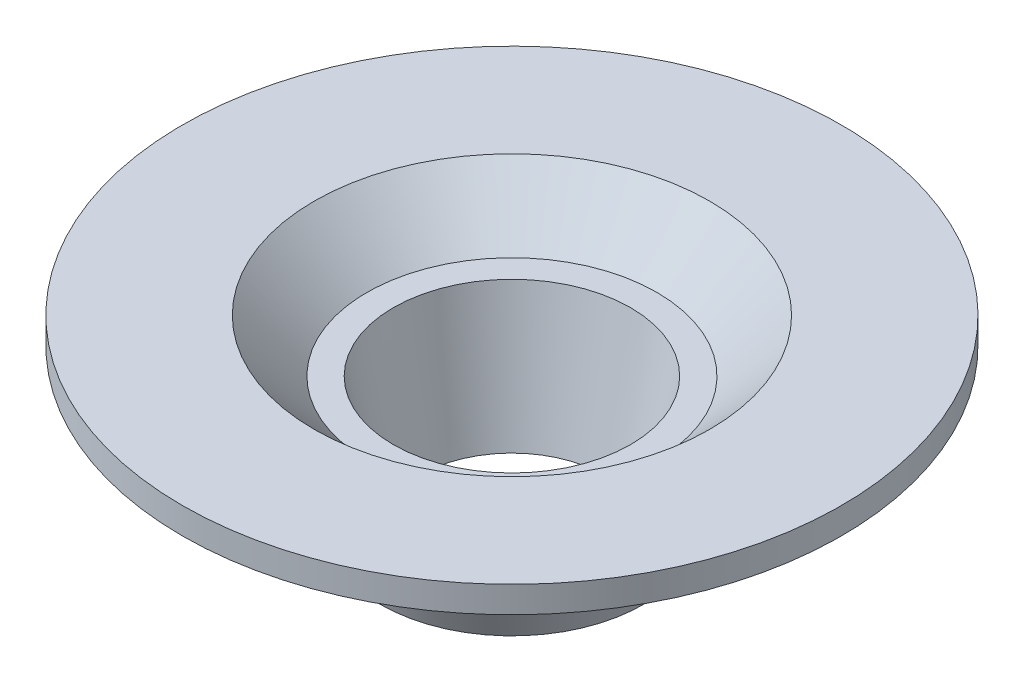
ISO-10303-21;
HEADER;
FILE_DESCRIPTION(('STEP AP214'),'2;1');
FILE_NAME('part.step','',(''),(''),'','','');
FILE_SCHEMA(('AUTOMOTIVE_DESIGN { 1 0 10303 214 1 1 1 1 }'));
ENDSEC;
DATA;
#1=APPLICATION_CONTEXT('core data for automotive mechanical design processes');
#2=APPLICATION_PROTOCOL_DEFINITION('international standard','automotive_design',2000,#1);
#3=PRODUCT_CONTEXT('',#1,'mechanical');
#4=PRODUCT('Part','Part','',(#3));
#5=PRODUCT_RELATED_PRODUCT_CATEGORY('part','',(#4));
#6=PRODUCT_DEFINITION_FORMATION('','',#4);
#7=PRODUCT_DEFINITION_CONTEXT('part definition',#1,'design');
#8=PRODUCT_DEFINITION('design','',#6,#7);
#9=PRODUCT_DEFINITION_SHAPE('','',#8);
#10=(LENGTH_UNIT() NAMED_UNIT(*) SI_UNIT(.MILLI.,.METRE.));
#11=(NAMED_UNIT(*) PLANE_ANGLE_UNIT() SI_UNIT($,.RADIAN.));
#12=(NAMED_UNIT(*) SI_UNIT($,.STERADIAN.) SOLID_ANGLE_UNIT());
#13=UNCERTAINTY_MEASURE_WITH_UNIT(LENGTH_MEASURE(1.E-05),#10,'distance_accuracy_value','');
#14=(GEOMETRIC_REPRESENTATION_CONTEXT(3) GLOBAL_UNCERTAINTY_ASSIGNED_CONTEXT((#13)) GLOBAL_UNIT_ASSIGNED_CONTEXT((#10,
#11,#12)) REPRESENTATION_CONTEXT('',''));
#15=CARTESIAN_POINT('',(0.,0.,0.));
#16=DIRECTION('',(0.,0.,1.));
#17=DIRECTION('',(1.,0.,0.));
#18=AXIS2_PLACEMENT_3D('',#15,#16,#17);
#19=CARTESIAN_POINT('',(0.,0.,-5.5));
#20=DIRECTION('',(0.,-1.,0.));
#21=DIRECTION('',(0.,0.,-1.));
#22=AXIS2_PLACEMENT_3D('',#19,#20,#21);
#23=PLANE('',#22);
#24=CARTESIAN_POINT('',(0.,0.,0.));
#25=DIRECTION('',(0.,1.,0.));
#26=DIRECTION('',(0.,0.,1.));
#27=AXIS2_PLACEMENT_3D('',#24,#25,#26);
#28=CIRCLE('',#27,4.5);
#29=CARTESIAN_POINT('',(0.,0.,4.5));
#30=VERTEX_POINT('',#29);
#31=EDGE_CURVE('E87',#30,#30,#28,.T.);
#32=ORIENTED_EDGE('',*,*,#31,.F.);
#33=EDGE_LOOP('',(#32));
#34=FACE_BOUND('',#33,.T.);
#35=CARTESIAN_POINT('',(0.,0.,0.));
#36=DIRECTION('',(0.,1.,0.));
#37=DIRECTION('',(0.,0.,1.));
#38=AXIS2_PLACEMENT_3D('',#35,#36,#37);
#39=CIRCLE('',#38,5.5);
#40=CARTESIAN_POINT('',(0.,0.,5.5));
#41=VERTEX_POINT('',#40);
#42=EDGE_CURVE('E10',#41,#41,#39,.T.);
#43=ORIENTED_EDGE('',*,*,#42,.T.);
#44=EDGE_LOOP('',(#43));
#45=FACE_BOUND('',#44,.T.);
#46=ADVANCED_FACE('F40',(#34,#45),#23,.F.);
#47=CARTESIAN_POINT('',(0.,2.,0.));
#48=DIRECTION('',(0.,1.,0.));
#49=DIRECTION('',(0.,0.,1.));
#50=AXIS2_PLACEMENT_3D('',#47,#48,#49);
#51=CONICAL_SURFACE('',#50,7.5,0.785398163397448);
#52=ORIENTED_EDGE('',*,*,#42,.F.);
#53=EDGE_LOOP('',(#52));
#54=FACE_BOUND('',#53,.T.);
#55=CARTESIAN_POINT('',(0.,2.,0.));
#56=DIRECTION('',(0.,1.,0.));
#57=DIRECTION('',(0.,0.,1.));
#58=AXIS2_PLACEMENT_3D('',#55,#56,#57);
#59=CIRCLE('',#58,7.5);
#60=CARTESIAN_POINT('',(0.,2.,7.5));
#61=VERTEX_POINT('',#60);
#62=EDGE_CURVE('E47',#61,#61,#59,.T.);
#63=ORIENTED_EDGE('',*,*,#62,.T.);
#64=EDGE_LOOP('',(#63));
#65=FACE_BOUND('',#64,.T.);
#66=ADVANCED_FACE('F97',(#54,#65),#51,.F.);
#67=CARTESIAN_POINT('',(0.,2.,-12.5));
#68=DIRECTION('',(0.,-1.,0.));
#69=DIRECTION('',(0.,0.,-1.));
#70=AXIS2_PLACEMENT_3D('',#67,#68,#69);
#71=PLANE('',#70);
#72=ORIENTED_EDGE('',*,*,#62,.F.);
#73=EDGE_LOOP('',(#72));
#74=FACE_BOUND('',#73,.T.);
#75=CARTESIAN_POINT('',(0.,2.,0.));
#76=DIRECTION('',(0.,1.,0.));
#77=DIRECTION('',(0.,0.,1.));
#78=AXIS2_PLACEMENT_3D('',#75,#76,#77);
#79=CIRCLE('',#78,12.5);
#80=CARTESIAN_POINT('',(0.,2.,12.5));
#81=VERTEX_POINT('',#80);
#82=EDGE_CURVE('E54',#81,#81,#79,.T.);
#83=ORIENTED_EDGE('',*,*,#82,.T.);
#84=EDGE_LOOP('',(#83));
#85=FACE_BOUND('',#84,.T.);
#86=ADVANCED_FACE('F101',(#74,#85),#71,.F.);
#87=CARTESIAN_POINT('',(0.,0.,0.));
#88=DIRECTION('',(0.,1.,0.));
#89=DIRECTION('',(0.,0.,1.));
#90=AXIS2_PLACEMENT_3D('',#87,#88,#89);
#91=CYLINDRICAL_SURFACE('',#90,12.5);
#92=ORIENTED_EDGE('',*,*,#82,.F.);
#93=EDGE_LOOP('',(#92));
#94=FACE_BOUND('',#93,.T.);
#95=CARTESIAN_POINT('',(0.,1.,0.));
#96=DIRECTION('',(0.,1.,0.));
#97=DIRECTION('',(0.,0.,1.));
#98=AXIS2_PLACEMENT_3D('',#95,#96,#97);
#99=CIRCLE('',#98,12.5);
#100=CARTESIAN_POINT('',(0.,0.999999999999998,12.5));
#101=VERTEX_POINT('',#100);
#102=EDGE_CURVE('E61',#101,#101,#99,.T.);
#103=ORIENTED_EDGE('',*,*,#102,.T.);
#104=EDGE_LOOP('',(#103));
#105=FACE_BOUND('',#104,.T.);
#106=ADVANCED_FACE('F106',(#94,#105),#91,.T.);
#107=CARTESIAN_POINT('',(0.,1.,-10.5));
#108=DIRECTION('',(0.,1.,0.));
#109=DIRECTION('',(0.,0.,1.));
#110=AXIS2_PLACEMENT_3D('',#107,#108,#109);
#111=PLANE('',#110);
#112=ORIENTED_EDGE('',*,*,#102,.F.);
#113=EDGE_LOOP('',(#112));
#114=FACE_BOUND('',#113,.T.);
#115=CARTESIAN_POINT('',(0.,1.,0.));
#116=DIRECTION('',(0.,1.,0.));
#117=DIRECTION('',(0.,0.,1.));
#118=AXIS2_PLACEMENT_3D('',#115,#116,#117);
#119=CIRCLE('',#118,10.5);
#120=CARTESIAN_POINT('',(0.,0.999999999999999,10.5));
#121=VERTEX_POINT('',#120);
#122=EDGE_CURVE('E67',#121,#121,#119,.T.);
#123=ORIENTED_EDGE('',*,*,#122,.T.);
#124=EDGE_LOOP('',(#123));
#125=FACE_BOUND('',#124,.T.);
#126=ADVANCED_FACE('F112',(#114,#125),#111,.F.);
#127=CARTESIAN_POINT('',(0.,-1.,0.));
#128=DIRECTION('',(0.,1.,0.));
#129=DIRECTION('',(0.,0.,1.));
#130=AXIS2_PLACEMENT_3D('',#127,#128,#129);
#131=CONICAL_SURFACE('',#130,8.5,0.785398163397449);
#132=ORIENTED_EDGE('',*,*,#122,.F.);
#133=EDGE_LOOP('',(#132));
#134=FACE_BOUND('',#133,.T.);
#135=CARTESIAN_POINT('',(0.,-1.,0.));
#136=DIRECTION('',(0.,1.,0.));
#137=DIRECTION('',(0.,0.,1.));
#138=AXIS2_PLACEMENT_3D('',#135,#136,#137);
#139=CIRCLE('',#138,8.5);
#140=CARTESIAN_POINT('',(0.,-1.,8.5));
#141=VERTEX_POINT('',#140);
#142=EDGE_CURVE('E71',#141,#141,#139,.T.);
#143=ORIENTED_EDGE('',*,*,#142,.T.);
#144=EDGE_LOOP('',(#143));
#145=FACE_BOUND('',#144,.T.);
#146=ADVANCED_FACE('F116',(#134,#145),#131,.T.);
#147=CARTESIAN_POINT('',(0.,-1.,-6.5));
#148=DIRECTION('',(0.,1.,0.));
#149=DIRECTION('',(0.,0.,1.));
#150=AXIS2_PLACEMENT_3D('',#147,#148,#149);
#151=PLANE('',#150);
#152=ORIENTED_EDGE('',*,*,#142,.F.);
#153=EDGE_LOOP('',(#152));
#154=FACE_BOUND('',#153,.T.);
#155=CARTESIAN_POINT('',(0.,-1.,0.));
#156=DIRECTION('',(0.,1.,0.));
#157=DIRECTION('',(0.,0.,1.));
#158=AXIS2_PLACEMENT_3D('',#155,#156,#157);
#159=CIRCLE('',#158,6.5);
#160=CARTESIAN_POINT('',(0.,-1.,6.5));
#161=VERTEX_POINT('',#160);
#162=EDGE_CURVE('E75',#161,#161,#159,.T.);
#163=ORIENTED_EDGE('',*,*,#162,.T.);
#164=EDGE_LOOP('',(#163));
#165=FACE_BOUND('',#164,.T.);
#166=ADVANCED_FACE('F120',(#154,#165),#151,.F.);
#167=CARTESIAN_POINT('',(0.,-5.,0.));
#168=DIRECTION('',(0.,1.,0.));
#169=DIRECTION('',(0.,0.,1.));
#170=AXIS2_PLACEMENT_3D('',#167,#168,#169);
#171=CONICAL_SURFACE('',#170,4.99694349375628,0.359440421092515);
#172=ORIENTED_EDGE('',*,*,#162,.F.);
#173=EDGE_LOOP('',(#172));
#174=FACE_BOUND('',#173,.T.);
#175=CARTESIAN_POINT('',(0.,-5.,0.));
#176=DIRECTION('',(0.,1.,0.));
#177=DIRECTION('',(0.,0.,1.));
#178=AXIS2_PLACEMENT_3D('',#175,#176,#177);
#179=CIRCLE('',#178,4.99694349375628);
#180=CARTESIAN_POINT('',(0.,-5.,4.99694349375628));
#181=VERTEX_POINT('',#180);
#182=EDGE_CURVE('E79',#181,#181,#179,.T.);
#183=ORIENTED_EDGE('',*,*,#182,.T.);
#184=EDGE_LOOP('',(#183));
#185=FACE_BOUND('',#184,.T.);
#186=ADVANCED_FACE('F124',(#174,#185),#171,.T.);
#187=CARTESIAN_POINT('',(0.,-5.,-3.49694349375628));
#188=DIRECTION('',(0.,1.,0.));
#189=DIRECTION('',(0.,0.,1.));
#190=AXIS2_PLACEMENT_3D('',#187,#188,#189);
#191=PLANE('',#190);
#192=ORIENTED_EDGE('',*,*,#182,.F.);
#193=EDGE_LOOP('',(#192));
#194=FACE_BOUND('',#193,.T.);
#195=CARTESIAN_POINT('',(0.,-5.,0.));
#196=DIRECTION('',(0.,1.,0.));
#197=DIRECTION('',(0.,0.,1.));
#198=AXIS2_PLACEMENT_3D('',#195,#196,#197);
#199=CIRCLE('',#198,3.49694349375628);
#200=CARTESIAN_POINT('',(0.,-5.,3.49694349375628));
#201=VERTEX_POINT('',#200);
#202=EDGE_CURVE('E83',#201,#201,#199,.T.);
#203=ORIENTED_EDGE('',*,*,#202,.T.);
#204=EDGE_LOOP('',(#203));
#205=FACE_BOUND('',#204,.T.);
#206=ADVANCED_FACE('F128',(#194,#205),#191,.F.);
#207=CARTESIAN_POINT('',(0.,0.,0.));
#208=DIRECTION('',(0.,1.,0.));
#209=DIRECTION('',(0.,0.,1.));
#210=AXIS2_PLACEMENT_3D('',#207,#208,#209);
#211=CONICAL_SURFACE('',#210,4.5,0.197983280353249);
#212=ORIENTED_EDGE('',*,*,#202,.F.);
#213=EDGE_LOOP('',(#212));
#214=FACE_BOUND('',#213,.T.);
#215=ORIENTED_EDGE('',*,*,#31,.T.);
#216=EDGE_LOOP('',(#215));
#217=FACE_BOUND('',#216,.T.);
#218=ADVANCED_FACE('F94',(#214,#217),#211,.F.);
#219=CLOSED_SHELL('',(#46,#66,#86,#106,#126,#146,#166,#186,#206,#218));
#220=MANIFOLD_SOLID_BREP('B2',#219);
#221=ADVANCED_BREP_SHAPE_REPRESENTATION('',(#18,#220),#14);
#222=SHAPE_DEFINITION_REPRESENTATION(#9,#221);
ENDSEC;
END-ISO-10303-21;
